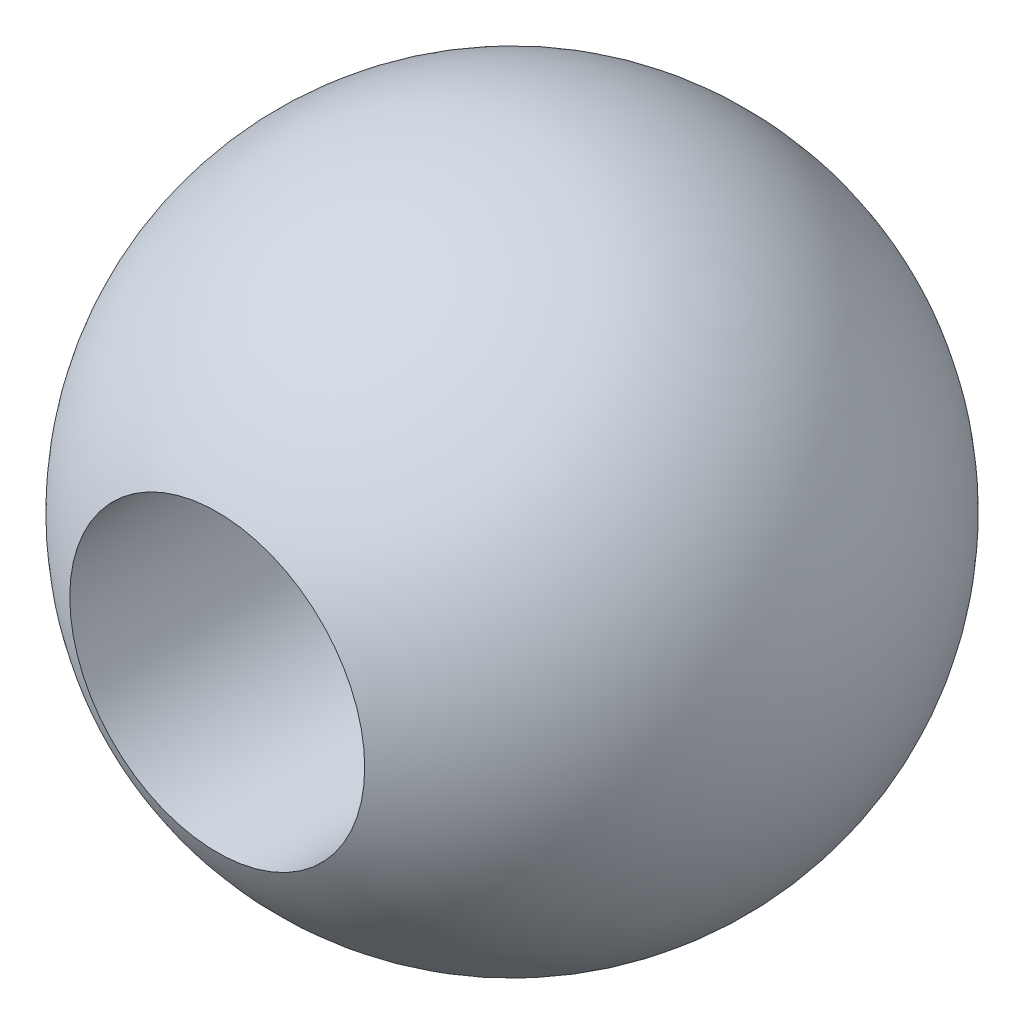
ISO-10303-21;
HEADER;
FILE_DESCRIPTION(('STEP AP214'),'2;1');
FILE_NAME('part.step','',(''),(''),'','','');
FILE_SCHEMA(('AUTOMOTIVE_DESIGN { 1 0 10303 214 1 1 1 1 }'));
ENDSEC;
DATA;
#1=APPLICATION_CONTEXT('core data for automotive mechanical design processes');
#2=APPLICATION_PROTOCOL_DEFINITION('international standard','automotive_design',2000,#1);
#3=PRODUCT_CONTEXT('',#1,'mechanical');
#4=PRODUCT('Part','Part','',(#3));
#5=PRODUCT_RELATED_PRODUCT_CATEGORY('part','',(#4));
#6=PRODUCT_DEFINITION_FORMATION('','',#4);
#7=PRODUCT_DEFINITION_CONTEXT('part definition',#1,'design');
#8=PRODUCT_DEFINITION('design','',#6,#7);
#9=PRODUCT_DEFINITION_SHAPE('','',#8);
#10=(LENGTH_UNIT() NAMED_UNIT(*) SI_UNIT(.MILLI.,.METRE.));
#11=(NAMED_UNIT(*) PLANE_ANGLE_UNIT() SI_UNIT($,.RADIAN.));
#12=(NAMED_UNIT(*) SI_UNIT($,.STERADIAN.) SOLID_ANGLE_UNIT());
#13=UNCERTAINTY_MEASURE_WITH_UNIT(LENGTH_MEASURE(1.E-05),#10,'distance_accuracy_value','');
#14=(GEOMETRIC_REPRESENTATION_CONTEXT(3) GLOBAL_UNCERTAINTY_ASSIGNED_CONTEXT((#13)) GLOBAL_UNIT_ASSIGNED_CONTEXT((#10,
#11,#12)) REPRESENTATION_CONTEXT('',''));
#15=CARTESIAN_POINT('',(0.,0.,0.));
#16=DIRECTION('',(0.,0.,1.));
#17=DIRECTION('',(1.,0.,0.));
#18=AXIS2_PLACEMENT_3D('',#15,#16,#17);
#19=CARTESIAN_POINT('',(0.,0.,0.));
#20=DIRECTION('',(0.,1.,0.));
#21=DIRECTION('',(1.,0.,0.));
#22=AXIS2_PLACEMENT_3D('',#19,#20,#21);
#23=SPHERICAL_SURFACE('',#22,7.5);
#24=CARTESIAN_POINT('',(0.,0.,0.));
#25=DIRECTION('',(0.,0.,-1.));
#26=DIRECTION('',(-1.,0.,0.));
#27=AXIS2_PLACEMENT_3D('',#24,#25,#26);
#28=SPHERICAL_SURFACE('',#27,7.5);
#29=CARTESIAN_POINT('',(0.,0.,6.70760192283019));
#30=DIRECTION('',(0.,0.,-1.));
#31=DIRECTION('',(-1.,0.,0.));
#32=AXIS2_PLACEMENT_3D('',#29,#30,#31);
#33=CIRCLE('',#32,3.3553057155563);
#34=CARTESIAN_POINT('',(-3.3553057155563,0.,6.70760192283019));
#35=VERTEX_POINT('',#34);
#36=EDGE_CURVE('E10',#35,#35,#33,.F.);
#37=ORIENTED_EDGE('',*,*,#36,.F.);
#38=EDGE_LOOP('',(#37));
#39=FACE_BOUND('',#38,.T.);
#40=CARTESIAN_POINT('',(0.,0.,-6.70760192283019));
#41=DIRECTION('',(0.,0.,1.));
#42=DIRECTION('',(1.,0.,0.));
#43=AXIS2_PLACEMENT_3D('',#40,#41,#42);
#44=CIRCLE('',#43,3.3553057155563);
#45=CARTESIAN_POINT('',(3.3553057155563,0.,-6.70760192283019));
#46=VERTEX_POINT('',#45);
#47=EDGE_CURVE('E42',#46,#46,#44,.F.);
#48=ORIENTED_EDGE('',*,*,#47,.F.);
#49=EDGE_LOOP('',(#48));
#50=FACE_BOUND('',#49,.T.);
#51=ADVANCED_FACE('F36',(#39,#50),#28,.T.);
#52=CARTESIAN_POINT('',(0.,0.,-29.));
#53=DIRECTION('',(0.,0.,1.));
#54=DIRECTION('',(1.,0.,0.));
#55=AXIS2_PLACEMENT_3D('',#52,#53,#54);
#56=CYLINDRICAL_SURFACE('',#55,3.3553057155563);
#57=ORIENTED_EDGE('',*,*,#36,.T.);
#58=EDGE_LOOP('',(#57));
#59=FACE_BOUND('',#58,.T.);
#60=ORIENTED_EDGE('',*,*,#47,.T.);
#61=EDGE_LOOP('',(#60));
#62=FACE_BOUND('',#61,.T.);
#63=ADVANCED_FACE('F48',(#59,#62),#56,.F.);
#64=CLOSED_SHELL('',(#51,#63));
#65=MANIFOLD_SOLID_BREP('B2',#64);
#66=ADVANCED_BREP_SHAPE_REPRESENTATION('',(#18,#65),#14);
#67=SHAPE_DEFINITION_REPRESENTATION(#9,#66);
ENDSEC;
END-ISO-10303-21;
